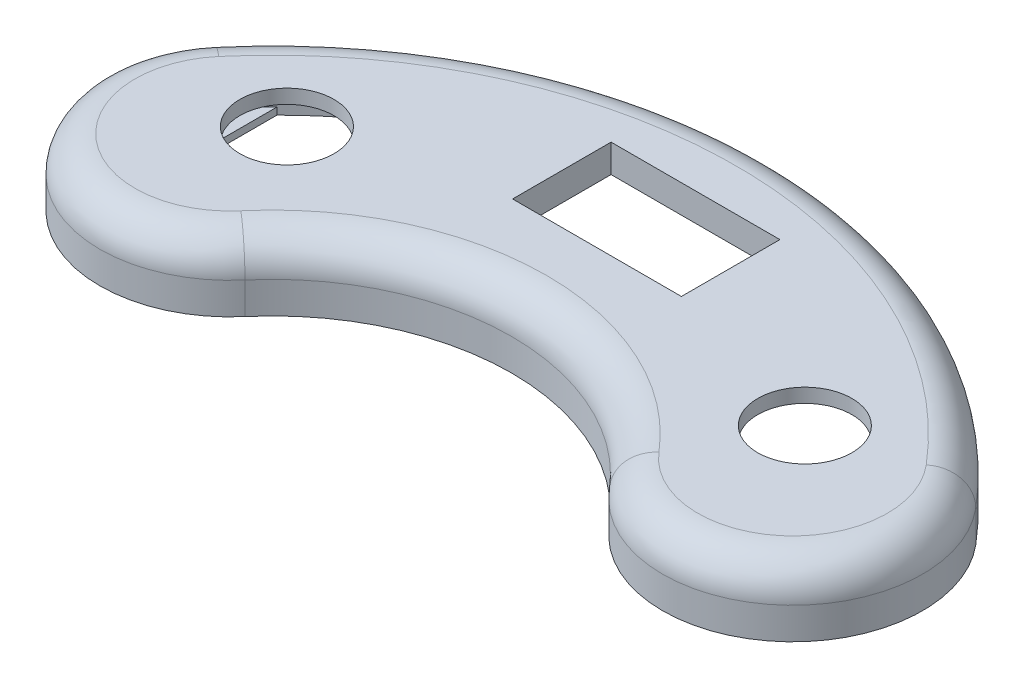
ISO-10303-21;
HEADER;
FILE_DESCRIPTION(('STEP AP214'),'2;1');
FILE_NAME('part.step','',(''),(''),'','','');
FILE_SCHEMA(('AUTOMOTIVE_DESIGN { 1 0 10303 214 1 1 1 1 }'));
ENDSEC;
DATA;
#1=APPLICATION_CONTEXT('core data for automotive mechanical design processes');
#2=APPLICATION_PROTOCOL_DEFINITION('international standard','automotive_design',2000,#1);
#3=PRODUCT_CONTEXT('',#1,'mechanical');
#4=PRODUCT('Part','Part','',(#3));
#5=PRODUCT_RELATED_PRODUCT_CATEGORY('part','',(#4));
#6=PRODUCT_DEFINITION_FORMATION('','',#4);
#7=PRODUCT_DEFINITION_CONTEXT('part definition',#1,'design');
#8=PRODUCT_DEFINITION('design','',#6,#7);
#9=PRODUCT_DEFINITION_SHAPE('','',#8);
#10=(LENGTH_UNIT() NAMED_UNIT(*) SI_UNIT(.MILLI.,.METRE.));
#11=(NAMED_UNIT(*) PLANE_ANGLE_UNIT() SI_UNIT($,.RADIAN.));
#12=(NAMED_UNIT(*) SI_UNIT($,.STERADIAN.) SOLID_ANGLE_UNIT());
#13=UNCERTAINTY_MEASURE_WITH_UNIT(LENGTH_MEASURE(1.E-05),#10,'distance_accuracy_value','');
#14=(GEOMETRIC_REPRESENTATION_CONTEXT(3) GLOBAL_UNCERTAINTY_ASSIGNED_CONTEXT((#13)) GLOBAL_UNIT_ASSIGNED_CONTEXT((#10,
#11,#12)) REPRESENTATION_CONTEXT('',''));
#15=CARTESIAN_POINT('',(0.,0.,0.));
#16=DIRECTION('',(0.,0.,1.));
#17=DIRECTION('',(1.,0.,0.));
#18=AXIS2_PLACEMENT_3D('',#15,#16,#17);
#19=CARTESIAN_POINT('',(7.10637196599272,19.05,43.0279017301496));
#20=DIRECTION('',(0.,-1.,0.));
#21=DIRECTION('',(0.,0.,-1.));
#22=AXIS2_PLACEMENT_3D('',#19,#20,#21);
#23=CYLINDRICAL_SURFACE('',#22,87.5028658682994);
#24=CARTESIAN_POINT('',(7.10637196599272,10.795,43.0279017301496));
#25=DIRECTION('',(0.,-1.,0.));
#26=DIRECTION('',(0.,0.,-1.));
#27=AXIS2_PLACEMENT_3D('',#24,#25,#26);
#28=CIRCLE('',#27,87.5028658682994);
#29=CARTESIAN_POINT('',(-56.9276674799536,10.795,-16.6076021865659));
#30=VERTEX_POINT('',#29);
#31=CARTESIAN_POINT('',(-54.3876674799536,10.795,-19.2234809676347));
#32=VERTEX_POINT('',#31);
#33=EDGE_CURVE('E458',#30,#32,#28,.T.);
#34=ORIENTED_EDGE('',*,*,#33,.T.);
#35=DIRECTION('',(0.,-1.,0.));
#36=VECTOR('',#35,1.);
#37=CARTESIAN_POINT('',(-54.3876674799537,19.05,-19.2234809676347));
#38=LINE('',#37,#36);
#39=CARTESIAN_POINT('',(-54.3876674799537,9.525,-19.2234809676347));
#40=VERTEX_POINT('',#39);
#41=EDGE_CURVE('E461',#32,#40,#38,.T.);
#42=ORIENTED_EDGE('',*,*,#41,.T.);
#43=CARTESIAN_POINT('',(7.10637196599272,9.525,43.0279017301496));
#44=DIRECTION('',(0.,1.,0.));
#45=DIRECTION('',(0.,0.,1.));
#46=AXIS2_PLACEMENT_3D('',#43,#44,#45);
#47=CIRCLE('',#46,87.5028658682994);
#48=CARTESIAN_POINT('',(68.6004114119391,9.525,-19.2234809676347));
#49=VERTEX_POINT('',#48);
#50=EDGE_CURVE('E243',#49,#40,#47,.T.);
#51=ORIENTED_EDGE('',*,*,#50,.F.);
#52=DIRECTION('',(0.,-1.,0.));
#53=VECTOR('',#52,1.);
#54=CARTESIAN_POINT('',(68.6004114119391,19.05,-19.2234809676347));
#55=LINE('',#54,#53);
#56=CARTESIAN_POINT('',(68.600411411939,10.795,-19.2234809676347));
#57=VERTEX_POINT('',#56);
#58=EDGE_CURVE('E440',#49,#57,#55,.F.);
#59=ORIENTED_EDGE('',*,*,#58,.T.);
#60=CARTESIAN_POINT('',(7.10637196599272,10.795,43.0279017301496));
#61=DIRECTION('',(0.,1.,0.));
#62=DIRECTION('',(0.,0.,1.));
#63=AXIS2_PLACEMENT_3D('',#60,#61,#62);
#64=CIRCLE('',#63,87.5028658682994);
#65=CARTESIAN_POINT('',(71.1404114119391,10.795,-16.6076021865659));
#66=VERTEX_POINT('',#65);
#67=EDGE_CURVE('E44',#66,#57,#64,.T.);
#68=ORIENTED_EDGE('',*,*,#67,.F.);
#69=DIRECTION('',(0.,-1.,0.));
#70=VECTOR('',#69,1.);
#71=CARTESIAN_POINT('',(71.1404114119391,19.05,-16.6076021865659));
#72=LINE('',#71,#70);
#73=CARTESIAN_POINT('',(71.1404114119391,9.525,-16.6076021865659));
#74=VERTEX_POINT('',#73);
#75=EDGE_CURVE('E451',#66,#74,#72,.T.);
#76=ORIENTED_EDGE('',*,*,#75,.T.);
#77=CARTESIAN_POINT('',(73.876796529036,9.525,-13.5270444623503));
#78=VERTEX_POINT('',#77);
#79=EDGE_CURVE('E245',#78,#74,#47,.T.);
#80=ORIENTED_EDGE('',*,*,#79,.F.);
#81=DIRECTION('',(0.,-1.,0.));
#82=VECTOR('',#81,1.);
#83=CARTESIAN_POINT('',(73.876796529036,19.05,-13.5270444623503));
#84=LINE('',#83,#82);
#85=CARTESIAN_POINT('',(73.876796529036,15.24,-13.5270444623503));
#86=VERTEX_POINT('',#85);
#87=EDGE_CURVE('E321',#86,#78,#84,.T.);
#88=ORIENTED_EDGE('',*,*,#87,.F.);
#89=CARTESIAN_POINT('',(7.10637196599272,15.24,43.0279017301496));
#90=DIRECTION('',(0.,1.,0.));
#91=DIRECTION('',(0.,0.,1.));
#92=AXIS2_PLACEMENT_3D('',#89,#90,#91);
#93=CIRCLE('',#92,87.5028658682994);
#94=CARTESIAN_POINT('',(-59.6640525970506,15.24,-13.5270444623502));
#95=VERTEX_POINT('',#94);
#96=EDGE_CURVE('E338',#95,#86,#93,.F.);
#97=ORIENTED_EDGE('',*,*,#96,.F.);
#98=DIRECTION('',(0.,-1.,0.));
#99=VECTOR('',#98,1.);
#100=CARTESIAN_POINT('',(-59.6640525970506,19.05,-13.5270444623502));
#101=LINE('',#100,#99);
#102=CARTESIAN_POINT('',(-59.6640525970506,9.525,-13.5270444623502));
#103=VERTEX_POINT('',#102);
#104=EDGE_CURVE('E319',#95,#103,#101,.T.);
#105=ORIENTED_EDGE('',*,*,#104,.T.);
#106=CARTESIAN_POINT('',(-56.9276674799537,9.525,-16.6076021865659));
#107=VERTEX_POINT('',#106);
#108=EDGE_CURVE('E240',#107,#103,#47,.T.);
#109=ORIENTED_EDGE('',*,*,#108,.F.);
#110=DIRECTION('',(0.,-1.,0.));
#111=VECTOR('',#110,1.);
#112=CARTESIAN_POINT('',(-56.9276674799537,19.05,-16.6076021865659));
#113=LINE('',#112,#111);
#114=EDGE_CURVE('E225',#107,#30,#113,.F.);
#115=ORIENTED_EDGE('',*,*,#114,.T.);
#116=EDGE_LOOP('',(#34,#42,#51,#59,#68,#76,#80,#88,#97,#105,#109,#115));
#117=FACE_BOUND('',#116,.T.);
#118=ADVANCED_FACE('F36',(#117),#23,.F.);
#119=CARTESIAN_POINT('',(-43.6936280340073,19.05,0.));
#120=DIRECTION('',(0.,-1.,0.));
#121=DIRECTION('',(0.,0.,-1.));
#122=AXIS2_PLACEMENT_3D('',#119,#120,#121);
#123=CYLINDRICAL_SURFACE('',#122,20.929295081542);
#124=CARTESIAN_POINT('',(-43.6936280340073,9.525,0.));
#125=DIRECTION('',(0.,1.,0.));
#126=DIRECTION('',(0.,0.,1.));
#127=AXIS2_PLACEMENT_3D('',#124,#125,#126);
#128=CIRCLE('',#127,20.929295081542);
#129=CARTESIAN_POINT('',(-54.3876674799537,9.525,17.9909119540617));
#130=VERTEX_POINT('',#129);
#131=CARTESIAN_POINT('',(-27.723203470964,9.525,13.5270444623503));
#132=VERTEX_POINT('',#131);
#133=EDGE_CURVE('E241',#130,#132,#128,.T.);
#134=ORIENTED_EDGE('',*,*,#133,.F.);
#135=DIRECTION('',(0.,-1.,0.));
#136=VECTOR('',#135,1.);
#137=CARTESIAN_POINT('',(-54.3876674799537,19.05,17.9909119540617));
#138=LINE('',#137,#136);
#139=CARTESIAN_POINT('',(-54.3876674799537,10.795,17.9909119540617));
#140=VERTEX_POINT('',#139);
#141=EDGE_CURVE('E463',#130,#140,#138,.F.);
#142=ORIENTED_EDGE('',*,*,#141,.T.);
#143=CARTESIAN_POINT('',(-43.6936280340073,10.795,0.));
#144=DIRECTION('',(0.,-1.,0.));
#145=DIRECTION('',(0.,0.,-1.));
#146=AXIS2_PLACEMENT_3D('',#143,#144,#145);
#147=CIRCLE('',#146,20.929295081542);
#148=CARTESIAN_POINT('',(-56.9276674799537,10.795,16.2140554012065));
#149=VERTEX_POINT('',#148);
#150=EDGE_CURVE('E12',#140,#149,#147,.T.);
#151=ORIENTED_EDGE('',*,*,#150,.T.);
#152=DIRECTION('',(0.,-1.,0.));
#153=VECTOR('',#152,1.);
#154=CARTESIAN_POINT('',(-56.9276674799537,19.05,16.2140554012065));
#155=LINE('',#154,#153);
#156=CARTESIAN_POINT('',(-56.9276674799537,9.525,16.2140554012065));
#157=VERTEX_POINT('',#156);
#158=EDGE_CURVE('E222',#149,#157,#155,.T.);
#159=ORIENTED_EDGE('',*,*,#158,.T.);
#160=EDGE_CURVE('E234',#103,#157,#128,.T.);
#161=ORIENTED_EDGE('',*,*,#160,.F.);
#162=ORIENTED_EDGE('',*,*,#104,.F.);
#163=CARTESIAN_POINT('',(-43.6936280340073,15.24,0.));
#164=DIRECTION('',(0.,1.,0.));
#165=DIRECTION('',(0.,0.,1.));
#166=AXIS2_PLACEMENT_3D('',#163,#164,#165);
#167=CIRCLE('',#166,20.929295081542);
#168=CARTESIAN_POINT('',(-27.723203470964,15.24,13.5270444623503));
#169=VERTEX_POINT('',#168);
#170=EDGE_CURVE('E336',#169,#95,#167,.F.);
#171=ORIENTED_EDGE('',*,*,#170,.F.);
#172=DIRECTION('',(0.,-1.,0.));
#173=VECTOR('',#172,1.);
#174=CARTESIAN_POINT('',(-27.723203470964,19.05,13.5270444623503));
#175=LINE('',#174,#173);
#176=EDGE_CURVE('E315',#169,#132,#175,.T.);
#177=ORIENTED_EDGE('',*,*,#176,.T.);
#178=EDGE_LOOP('',(#134,#142,#151,#159,#161,#162,#171,#177));
#179=FACE_BOUND('',#178,.T.);
#180=ADVANCED_FACE('F232',(#179),#123,.F.);
#181=CARTESIAN_POINT('',(57.9063719659927,19.05,0.));
#182=DIRECTION('',(0.,-1.,0.));
#183=DIRECTION('',(0.,0.,-1.));
#184=AXIS2_PLACEMENT_3D('',#181,#182,#183);
#185=CYLINDRICAL_SURFACE('',#184,20.929295081542);
#186=CARTESIAN_POINT('',(57.9063719659927,10.795,0.));
#187=DIRECTION('',(0.,1.,0.));
#188=DIRECTION('',(0.,0.,1.));
#189=AXIS2_PLACEMENT_3D('',#186,#187,#188);
#190=CIRCLE('',#189,20.929295081542);
#191=CARTESIAN_POINT('',(68.6004114119391,10.795,17.9909119540617));
#192=VERTEX_POINT('',#191);
#193=CARTESIAN_POINT('',(71.1404114119391,10.795,16.2140554012065));
#194=VERTEX_POINT('',#193);
#195=EDGE_CURVE('E246',#192,#194,#190,.T.);
#196=ORIENTED_EDGE('',*,*,#195,.F.);
#197=DIRECTION('',(0.,-1.,0.));
#198=VECTOR('',#197,1.);
#199=CARTESIAN_POINT('',(68.6004114119391,19.05,17.9909119540617));
#200=LINE('',#199,#198);
#201=CARTESIAN_POINT('',(68.6004114119391,9.525,17.9909119540617));
#202=VERTEX_POINT('',#201);
#203=EDGE_CURVE('E443',#192,#202,#200,.T.);
#204=ORIENTED_EDGE('',*,*,#203,.T.);
#205=CARTESIAN_POINT('',(57.9063719659927,9.525,0.));
#206=DIRECTION('',(0.,1.,0.));
#207=DIRECTION('',(0.,0.,1.));
#208=AXIS2_PLACEMENT_3D('',#205,#206,#207);
#209=CIRCLE('',#208,20.929295081542);
#210=CARTESIAN_POINT('',(41.9359474029494,9.525,13.5270444623503));
#211=VERTEX_POINT('',#210);
#212=EDGE_CURVE('E252',#211,#202,#209,.T.);
#213=ORIENTED_EDGE('',*,*,#212,.F.);
#214=DIRECTION('',(0.,-1.,0.));
#215=VECTOR('',#214,1.);
#216=CARTESIAN_POINT('',(41.9359474029494,19.05,13.5270444623503));
#217=LINE('',#216,#215);
#218=CARTESIAN_POINT('',(41.9359474029494,15.24,13.5270444623503));
#219=VERTEX_POINT('',#218);
#220=EDGE_CURVE('E313',#219,#211,#217,.T.);
#221=ORIENTED_EDGE('',*,*,#220,.F.);
#222=CARTESIAN_POINT('',(57.9063719659927,15.24,0.));
#223=DIRECTION('',(0.,1.,0.));
#224=DIRECTION('',(0.,0.,1.));
#225=AXIS2_PLACEMENT_3D('',#222,#223,#224);
#226=CIRCLE('',#225,20.929295081542);
#227=EDGE_CURVE('E340',#86,#219,#226,.F.);
#228=ORIENTED_EDGE('',*,*,#227,.F.);
#229=ORIENTED_EDGE('',*,*,#87,.T.);
#230=CARTESIAN_POINT('',(71.1404114119391,9.525,16.2140554012065));
#231=VERTEX_POINT('',#230);
#232=EDGE_CURVE('E251',#231,#78,#209,.T.);
#233=ORIENTED_EDGE('',*,*,#232,.F.);
#234=DIRECTION('',(0.,-1.,0.));
#235=VECTOR('',#234,1.);
#236=CARTESIAN_POINT('',(71.1404114119391,19.05,16.2140554012065));
#237=LINE('',#236,#235);
#238=EDGE_CURVE('E448',#231,#194,#237,.F.);
#239=ORIENTED_EDGE('',*,*,#238,.T.);
#240=EDGE_LOOP('',(#196,#204,#213,#221,#228,#229,#233,#239));
#241=FACE_BOUND('',#240,.T.);
#242=ADVANCED_FACE('F507',(#241),#185,.F.);
#243=CARTESIAN_POINT('',(32.5063719659927,21.59,21.5139508650748));
#244=DIRECTION('',(0.,1.,0.));
#245=DIRECTION('',(0.,0.,1.));
#246=AXIS2_PLACEMENT_3D('',#243,#244,#245);
#247=PLANE('',#246);
#248=CARTESIAN_POINT('',(53.8552329844878,21.59,-6.26058606286144));
#249=DIRECTION('',(0.,1.,0.));
#250=DIRECTION('',(0.,0.,1.));
#251=AXIS2_PLACEMENT_3D('',#248,#249,#250);
#252=CIRCLE('',#251,8.50000000000001);
#253=CARTESIAN_POINT('',(53.8552329844878,21.59,2.23941393713857));
#254=VERTEX_POINT('',#253);
#255=EDGE_CURVE('E267',#254,#254,#252,.T.);
#256=ORIENTED_EDGE('',*,*,#255,.F.);
#257=EDGE_LOOP('',(#256));
#258=FACE_BOUND('',#257,.T.);
#259=CARTESIAN_POINT('',(-39.6424890525023,21.59,-6.26058606286144));
#260=DIRECTION('',(0.,1.,0.));
#261=DIRECTION('',(0.,0.,1.));
#262=AXIS2_PLACEMENT_3D('',#259,#260,#261);
#263=CIRCLE('',#262,8.5);
#264=CARTESIAN_POINT('',(-39.6424890525023,21.59,2.23941393713856));
#265=VERTEX_POINT('',#264);
#266=EDGE_CURVE('E271',#265,#265,#263,.T.);
#267=ORIENTED_EDGE('',*,*,#266,.F.);
#268=EDGE_LOOP('',(#267));
#269=FACE_BOUND('',#268,.T.);
#270=CARTESIAN_POINT('',(-43.6936280340073,21.59,0.));
#271=DIRECTION('',(0.,1.,0.));
#272=DIRECTION('',(0.,0.,1.));
#273=AXIS2_PLACEMENT_3D('',#270,#271,#272);
#274=CIRCLE('',#273,17.119295081542);
#275=CARTESIAN_POINT('',(-56.7567727604326,21.59,-11.0645611727431));
#276=VERTEX_POINT('',#275);
#277=CARTESIAN_POINT('',(-30.630483307582,21.59,11.0645611727431));
#278=VERTEX_POINT('',#277);
#279=EDGE_CURVE('E351',#276,#278,#274,.T.);
#280=ORIENTED_EDGE('',*,*,#279,.T.);
#281=CARTESIAN_POINT('',(7.10637196599272,21.59,43.0279017301496));
#282=DIRECTION('',(0.,1.,0.));
#283=DIRECTION('',(0.,0.,1.));
#284=AXIS2_PLACEMENT_3D('',#281,#282,#283);
#285=CIRCLE('',#284,49.4542757052155);
#286=CARTESIAN_POINT('',(44.8432272395674,21.59,11.0645611727431));
#287=VERTEX_POINT('',#286);
#288=EDGE_CURVE('E353',#278,#287,#285,.F.);
#289=ORIENTED_EDGE('',*,*,#288,.T.);
#290=CARTESIAN_POINT('',(57.9063719659927,21.59,0.));
#291=DIRECTION('',(0.,1.,0.));
#292=DIRECTION('',(0.,0.,1.));
#293=AXIS2_PLACEMENT_3D('',#290,#291,#292);
#294=CIRCLE('',#293,17.119295081542);
#295=CARTESIAN_POINT('',(70.969516692418,21.59,-11.0645611727431));
#296=VERTEX_POINT('',#295);
#297=EDGE_CURVE('E358',#287,#296,#294,.T.);
#298=ORIENTED_EDGE('',*,*,#297,.T.);
#299=CARTESIAN_POINT('',(7.10637196599272,21.59,43.0279017301496));
#300=DIRECTION('',(0.,1.,0.));
#301=DIRECTION('',(0.,0.,1.));
#302=AXIS2_PLACEMENT_3D('',#299,#300,#301);
#303=CIRCLE('',#302,83.6928658682994);
#304=EDGE_CURVE('E354',#296,#276,#303,.T.);
#305=ORIENTED_EDGE('',*,*,#304,.T.);
#306=EDGE_LOOP('',(#280,#289,#298,#305));
#307=FACE_BOUND('',#306,.T.);
#308=DIRECTION('',(0.,0.,1.));
#309=VECTOR('',#308,1.);
#310=CARTESIAN_POINT('',(-7.95035958705516,21.59,21.5139508650748));
#311=LINE('',#310,#309);
#312=CARTESIAN_POINT('',(-7.95035958705517,21.59,-33.0865472509014));
#313=VERTEX_POINT('',#312);
#314=CARTESIAN_POINT('',(-7.95035958705517,21.59,-15.3065472509014));
#315=VERTEX_POINT('',#314);
#316=EDGE_CURVE('E362',#313,#315,#311,.T.);
#317=ORIENTED_EDGE('',*,*,#316,.F.);
#318=DIRECTION('',(1.,0.,0.));
#319=VECTOR('',#318,1.);
#320=CARTESIAN_POINT('',(32.5063719659927,21.59,-33.0865472509014));
#321=LINE('',#320,#319);
#322=CARTESIAN_POINT('',(22.5296404129448,21.59,-33.0865472509014));
#323=VERTEX_POINT('',#322);
#324=EDGE_CURVE('E342',#313,#323,#321,.T.);
#325=ORIENTED_EDGE('',*,*,#324,.T.);
#326=DIRECTION('',(0.,0.,1.));
#327=VECTOR('',#326,1.);
#328=CARTESIAN_POINT('',(22.5296404129448,21.59,21.5139508650748));
#329=LINE('',#328,#327);
#330=CARTESIAN_POINT('',(22.5296404129448,21.59,-15.3065472509014));
#331=VERTEX_POINT('',#330);
#332=EDGE_CURVE('E369',#323,#331,#329,.T.);
#333=ORIENTED_EDGE('',*,*,#332,.T.);
#334=DIRECTION('',(1.,0.,0.));
#335=VECTOR('',#334,1.);
#336=CARTESIAN_POINT('',(32.5063719659927,21.59,-15.3065472509014));
#337=LINE('',#336,#335);
#338=EDGE_CURVE('E366',#315,#331,#337,.T.);
#339=ORIENTED_EDGE('',*,*,#338,.F.);
#340=EDGE_LOOP('',(#317,#325,#333,#339));
#341=FACE_BOUND('',#340,.T.);
#342=ADVANCED_FACE('F513',(#258,#269,#307,#341),#247,.T.);
#343=CARTESIAN_POINT('',(57.9063719659927,19.05,0.));
#344=DIRECTION('',(0.,-1.,0.));
#345=DIRECTION('',(0.,0.,-1.));
#346=AXIS2_PLACEMENT_3D('',#343,#344,#345);
#347=CYLINDRICAL_SURFACE('',#346,23.469295081542);
#348=DIRECTION('',(0.,-1.,0.));
#349=VECTOR('',#348,1.);
#350=CARTESIAN_POINT('',(39.9977608452041,19.05,15.168699988755));
#351=LINE('',#350,#349);
#352=CARTESIAN_POINT('',(39.9977608452041,15.24,15.168699988755));
#353=VERTEX_POINT('',#352);
#354=CARTESIAN_POINT('',(39.9977608452041,9.525,15.168699988755));
#355=VERTEX_POINT('',#354);
#356=EDGE_CURVE('E385',#353,#355,#351,.T.);
#357=ORIENTED_EDGE('',*,*,#356,.T.);
#358=CARTESIAN_POINT('',(57.9063719659927,9.525,0.));
#359=DIRECTION('',(0.,1.,0.));
#360=DIRECTION('',(0.,0.,1.));
#361=AXIS2_PLACEMENT_3D('',#358,#359,#360);
#362=CIRCLE('',#361,23.469295081542);
#363=CARTESIAN_POINT('',(75.8149830867813,9.525,-15.168699988755));
#364=VERTEX_POINT('',#363);
#365=EDGE_CURVE('E264',#355,#364,#362,.T.);
#366=ORIENTED_EDGE('',*,*,#365,.T.);
#367=DIRECTION('',(0.,-1.,0.));
#368=VECTOR('',#367,1.);
#369=CARTESIAN_POINT('',(75.8149830867813,19.05,-15.168699988755));
#370=LINE('',#369,#368);
#371=CARTESIAN_POINT('',(75.8149830867813,15.24,-15.168699988755));
#372=VERTEX_POINT('',#371);
#373=EDGE_CURVE('E360',#372,#364,#370,.T.);
#374=ORIENTED_EDGE('',*,*,#373,.F.);
#375=CARTESIAN_POINT('',(57.9063719659927,15.24,0.));
#376=DIRECTION('',(0.,-1.,0.));
#377=DIRECTION('',(0.,0.,-1.));
#378=AXIS2_PLACEMENT_3D('',#375,#376,#377);
#379=CIRCLE('',#378,23.469295081542);
#380=EDGE_CURVE('E381',#372,#353,#379,.T.);
#381=ORIENTED_EDGE('',*,*,#380,.T.);
#382=EDGE_LOOP('',(#357,#366,#374,#381));
#383=FACE_BOUND('',#382,.T.);
#384=ADVANCED_FACE('F531',(#383),#347,.T.);
#385=CARTESIAN_POINT('',(7.10637196599272,19.05,43.0279017301496));
#386=DIRECTION('',(0.,-1.,0.));
#387=DIRECTION('',(0.,0.,-1.));
#388=AXIS2_PLACEMENT_3D('',#385,#386,#387);
#389=CYLINDRICAL_SURFACE('',#388,90.0428658682994);
#390=ORIENTED_EDGE('',*,*,#373,.T.);
#391=CARTESIAN_POINT('',(7.10637196599272,9.525,43.0279017301496));
#392=DIRECTION('',(0.,1.,0.));
#393=DIRECTION('',(0.,0.,1.));
#394=AXIS2_PLACEMENT_3D('',#391,#392,#393);
#395=CIRCLE('',#394,90.0428658682994);
#396=CARTESIAN_POINT('',(-61.6022391547959,9.525,-15.168699988755));
#397=VERTEX_POINT('',#396);
#398=EDGE_CURVE('E261',#364,#397,#395,.T.);
#399=ORIENTED_EDGE('',*,*,#398,.T.);
#400=DIRECTION('',(0.,-1.,0.));
#401=VECTOR('',#400,1.);
#402=CARTESIAN_POINT('',(-61.6022391547959,19.05,-15.168699988755));
#403=LINE('',#402,#401);
#404=CARTESIAN_POINT('',(-61.6022391547959,15.24,-15.168699988755));
#405=VERTEX_POINT('',#404);
#406=EDGE_CURVE('E391',#405,#397,#403,.T.);
#407=ORIENTED_EDGE('',*,*,#406,.F.);
#408=CARTESIAN_POINT('',(7.10637196599272,15.24,43.0279017301496));
#409=DIRECTION('',(0.,-1.,0.));
#410=DIRECTION('',(0.,0.,-1.));
#411=AXIS2_PLACEMENT_3D('',#408,#409,#410);
#412=CIRCLE('',#411,90.0428658682994);
#413=EDGE_CURVE('E379',#405,#372,#412,.T.);
#414=ORIENTED_EDGE('',*,*,#413,.T.);
#415=EDGE_LOOP('',(#390,#399,#407,#414));
#416=FACE_BOUND('',#415,.T.);
#417=ADVANCED_FACE('F535',(#416),#389,.T.);
#418=CARTESIAN_POINT('',(-43.6936280340073,19.05,0.));
#419=DIRECTION('',(0.,-1.,0.));
#420=DIRECTION('',(0.,0.,-1.));
#421=AXIS2_PLACEMENT_3D('',#418,#419,#420);
#422=CYLINDRICAL_SURFACE('',#421,23.469295081542);
#423=ORIENTED_EDGE('',*,*,#406,.T.);
#424=CARTESIAN_POINT('',(-43.6936280340073,9.525,0.));
#425=DIRECTION('',(0.,1.,0.));
#426=DIRECTION('',(0.,0.,1.));
#427=AXIS2_PLACEMENT_3D('',#424,#425,#426);
#428=CIRCLE('',#427,23.469295081542);
#429=CARTESIAN_POINT('',(-25.7850169132187,9.525,15.168699988755));
#430=VERTEX_POINT('',#429);
#431=EDGE_CURVE('E258',#397,#430,#428,.T.);
#432=ORIENTED_EDGE('',*,*,#431,.T.);
#433=DIRECTION('',(0.,-1.,0.));
#434=VECTOR('',#433,1.);
#435=CARTESIAN_POINT('',(-25.7850169132187,19.05,15.168699988755));
#436=LINE('',#435,#434);
#437=CARTESIAN_POINT('',(-25.7850169132187,15.24,15.168699988755));
#438=VERTEX_POINT('',#437);
#439=EDGE_CURVE('E388',#438,#430,#436,.T.);
#440=ORIENTED_EDGE('',*,*,#439,.F.);
#441=CARTESIAN_POINT('',(-43.6936280340073,15.24,0.));
#442=DIRECTION('',(0.,-1.,0.));
#443=DIRECTION('',(0.,0.,-1.));
#444=AXIS2_PLACEMENT_3D('',#441,#442,#443);
#445=CIRCLE('',#444,23.469295081542);
#446=EDGE_CURVE('E382',#438,#405,#445,.T.);
#447=ORIENTED_EDGE('',*,*,#446,.T.);
#448=EDGE_LOOP('',(#423,#432,#440,#447));
#449=FACE_BOUND('',#448,.T.);
#450=ADVANCED_FACE('F539',(#449),#422,.T.);
#451=CARTESIAN_POINT('',(7.10637196599272,19.05,43.0279017301496));
#452=DIRECTION('',(0.,-1.,0.));
#453=DIRECTION('',(0.,0.,-1.));
#454=AXIS2_PLACEMENT_3D('',#451,#452,#453);
#455=CYLINDRICAL_SURFACE('',#454,43.1042757052155);
#456=ORIENTED_EDGE('',*,*,#439,.T.);
#457=CARTESIAN_POINT('',(7.10637196599272,9.525,43.0279017301496));
#458=DIRECTION('',(0.,1.,0.));
#459=DIRECTION('',(0.,0.,1.));
#460=AXIS2_PLACEMENT_3D('',#457,#458,#459);
#461=CIRCLE('',#460,43.1042757052155);
#462=EDGE_CURVE('E255',#430,#355,#461,.F.);
#463=ORIENTED_EDGE('',*,*,#462,.T.);
#464=ORIENTED_EDGE('',*,*,#356,.F.);
#465=CARTESIAN_POINT('',(7.10637196599272,15.24,43.0279017301496));
#466=DIRECTION('',(0.,-1.,0.));
#467=DIRECTION('',(0.,0.,-1.));
#468=AXIS2_PLACEMENT_3D('',#465,#466,#467);
#469=CIRCLE('',#468,43.1042757052155);
#470=EDGE_CURVE('E357',#353,#438,#469,.F.);
#471=ORIENTED_EDGE('',*,*,#470,.T.);
#472=EDGE_LOOP('',(#456,#463,#464,#471));
#473=FACE_BOUND('',#472,.T.);
#474=ADVANCED_FACE('F543',(#473),#455,.F.);
#475=CARTESIAN_POINT('',(7.10637196599272,15.24,43.0279017301496));
#476=DIRECTION('',(0.,1.,0.));
#477=DIRECTION('',(0.,0.,1.));
#478=AXIS2_PLACEMENT_3D('',#475,#476,#477);
#479=TOROIDAL_SURFACE('',#478,83.6928658682994,6.35);
#480=CARTESIAN_POINT('',(70.969516692418,15.24,-11.0645611727431));
#481=DIRECTION('',(0.646321073387707,0.,0.763065573915481));
#482=DIRECTION('',(0.763065573915481,0.,-0.646321073387707));
#483=AXIS2_PLACEMENT_3D('',#480,#481,#482);
#484=CIRCLE('',#483,6.35);
#485=EDGE_CURVE('E374',#372,#296,#484,.T.);
#486=ORIENTED_EDGE('',*,*,#485,.F.);
#487=ORIENTED_EDGE('',*,*,#413,.F.);
#488=CARTESIAN_POINT('',(-56.7567727604326,15.24,-11.0645611727431));
#489=DIRECTION('',(0.646321073387707,0.,-0.763065573915481));
#490=DIRECTION('',(-0.763065573915481,0.,-0.646321073387707));
#491=AXIS2_PLACEMENT_3D('',#488,#489,#490);
#492=CIRCLE('',#491,6.35);
#493=EDGE_CURVE('E377',#276,#405,#492,.F.);
#494=ORIENTED_EDGE('',*,*,#493,.F.);
#495=ORIENTED_EDGE('',*,*,#304,.F.);
#496=EDGE_LOOP('',(#486,#487,#494,#495));
#497=FACE_BOUND('',#496,.T.);
#498=ADVANCED_FACE('F547',(#497),#479,.T.);
#499=CARTESIAN_POINT('',(-43.6936280340073,15.24,0.));
#500=DIRECTION('',(0.,1.,0.));
#501=DIRECTION('',(0.,0.,1.));
#502=AXIS2_PLACEMENT_3D('',#499,#500,#501);
#503=TOROIDAL_SURFACE('',#502,17.119295081542,6.35);
#504=ORIENTED_EDGE('',*,*,#493,.T.);
#505=ORIENTED_EDGE('',*,*,#446,.F.);
#506=CARTESIAN_POINT('',(-30.630483307582,15.24,11.0645611727431));
#507=DIRECTION('',(0.646321073387707,0.,-0.763065573915481));
#508=DIRECTION('',(-0.763065573915481,0.,-0.646321073387707));
#509=AXIS2_PLACEMENT_3D('',#506,#507,#508);
#510=CIRCLE('',#509,6.35);
#511=EDGE_CURVE('E378',#278,#438,#510,.T.);
#512=ORIENTED_EDGE('',*,*,#511,.F.);
#513=ORIENTED_EDGE('',*,*,#279,.F.);
#514=EDGE_LOOP('',(#504,#505,#512,#513));
#515=FACE_BOUND('',#514,.T.);
#516=ADVANCED_FACE('F551',(#515),#503,.T.);
#517=CARTESIAN_POINT('',(57.9063719659927,15.24,0.));
#518=DIRECTION('',(0.,1.,0.));
#519=DIRECTION('',(0.,0.,1.));
#520=AXIS2_PLACEMENT_3D('',#517,#518,#519);
#521=TOROIDAL_SURFACE('',#520,17.119295081542,6.35);
#522=ORIENTED_EDGE('',*,*,#485,.T.);
#523=ORIENTED_EDGE('',*,*,#297,.F.);
#524=CARTESIAN_POINT('',(44.8432272395674,15.24,11.0645611727431));
#525=DIRECTION('',(0.646321073387707,0.,0.763065573915481));
#526=DIRECTION('',(0.763065573915481,0.,-0.646321073387707));
#527=AXIS2_PLACEMENT_3D('',#524,#525,#526);
#528=CIRCLE('',#527,6.35);
#529=EDGE_CURVE('E402',#353,#287,#528,.F.);
#530=ORIENTED_EDGE('',*,*,#529,.F.);
#531=ORIENTED_EDGE('',*,*,#380,.F.);
#532=EDGE_LOOP('',(#522,#523,#530,#531));
#533=FACE_BOUND('',#532,.T.);
#534=ADVANCED_FACE('F555',(#533),#521,.T.);
#535=CARTESIAN_POINT('',(7.10637196599272,15.24,43.0279017301496));
#536=DIRECTION('',(0.,1.,0.));
#537=DIRECTION('',(0.,0.,1.));
#538=AXIS2_PLACEMENT_3D('',#535,#536,#537);
#539=TOROIDAL_SURFACE('',#538,49.4542757052155,6.35);
#540=ORIENTED_EDGE('',*,*,#511,.T.);
#541=ORIENTED_EDGE('',*,*,#470,.F.);
#542=ORIENTED_EDGE('',*,*,#529,.T.);
#543=ORIENTED_EDGE('',*,*,#288,.F.);
#544=EDGE_LOOP('',(#540,#541,#542,#543));
#545=FACE_BOUND('',#544,.T.);
#546=ADVANCED_FACE('F559',(#545),#539,.T.);
#547=CARTESIAN_POINT('',(-10.4903595870552,16.51,-33.0865472509014));
#548=DIRECTION('',(0.,0.,1.));
#549=DIRECTION('',(1.,0.,0.));
#550=AXIS2_PLACEMENT_3D('',#547,#548,#549);
#551=PLANE('',#550);
#552=ORIENTED_EDGE('',*,*,#324,.F.);
#553=DIRECTION('',(0.,1.,0.));
#554=VECTOR('',#553,1.);
#555=CARTESIAN_POINT('',(-7.95035958705517,16.51,-33.0865472509014));
#556=LINE('',#555,#554);
#557=CARTESIAN_POINT('',(-7.95035958705517,16.51,-33.0865472509014));
#558=VERTEX_POINT('',#557);
#559=EDGE_CURVE('E405',#558,#313,#556,.T.);
#560=ORIENTED_EDGE('',*,*,#559,.F.);
#561=DIRECTION('',(1.,0.,0.));
#562=VECTOR('',#561,1.);
#563=CARTESIAN_POINT('',(-10.4903595870552,16.51,-33.0865472509014));
#564=LINE('',#563,#562);
#565=CARTESIAN_POINT('',(22.5296404129448,16.51,-33.0865472509014));
#566=VERTEX_POINT('',#565);
#567=EDGE_CURVE('E365',#558,#566,#564,.T.);
#568=ORIENTED_EDGE('',*,*,#567,.T.);
#569=DIRECTION('',(0.,1.,0.));
#570=VECTOR('',#569,1.);
#571=CARTESIAN_POINT('',(22.5296404129448,16.51,-33.0865472509014));
#572=LINE('',#571,#570);
#573=EDGE_CURVE('E404',#566,#323,#572,.T.);
#574=ORIENTED_EDGE('',*,*,#573,.T.);
#575=EDGE_LOOP('',(#552,#560,#568,#574));
#576=FACE_BOUND('',#575,.T.);
#577=ADVANCED_FACE('F563',(#576),#551,.T.);
#578=CARTESIAN_POINT('',(22.5296404129448,16.51,-35.6265472509014));
#579=DIRECTION('',(-1.,0.,0.));
#580=DIRECTION('',(0.,0.,1.));
#581=AXIS2_PLACEMENT_3D('',#578,#579,#580);
#582=PLANE('',#581);
#583=ORIENTED_EDGE('',*,*,#332,.F.);
#584=ORIENTED_EDGE('',*,*,#573,.F.);
#585=DIRECTION('',(0.,0.,1.));
#586=VECTOR('',#585,1.);
#587=CARTESIAN_POINT('',(22.5296404129448,16.51,-35.6265472509014));
#588=LINE('',#587,#586);
#589=CARTESIAN_POINT('',(22.5296404129448,16.51,-15.3065472509014));
#590=VERTEX_POINT('',#589);
#591=EDGE_CURVE('E417',#566,#590,#588,.T.);
#592=ORIENTED_EDGE('',*,*,#591,.T.);
#593=DIRECTION('',(0.,1.,0.));
#594=VECTOR('',#593,1.);
#595=CARTESIAN_POINT('',(22.5296404129448,16.51,-15.3065472509014));
#596=LINE('',#595,#594);
#597=EDGE_CURVE('E412',#590,#331,#596,.T.);
#598=ORIENTED_EDGE('',*,*,#597,.T.);
#599=EDGE_LOOP('',(#583,#584,#592,#598));
#600=FACE_BOUND('',#599,.T.);
#601=ADVANCED_FACE('F567',(#600),#582,.T.);
#602=CARTESIAN_POINT('',(-10.4903595870552,16.51,-15.3065472509014));
#603=DIRECTION('',(0.,0.,1.));
#604=DIRECTION('',(1.,0.,0.));
#605=AXIS2_PLACEMENT_3D('',#602,#603,#604);
#606=PLANE('',#605);
#607=ORIENTED_EDGE('',*,*,#338,.T.);
#608=ORIENTED_EDGE('',*,*,#597,.F.);
#609=DIRECTION('',(1.,0.,0.));
#610=VECTOR('',#609,1.);
#611=CARTESIAN_POINT('',(-10.4903595870552,16.51,-15.3065472509014));
#612=LINE('',#611,#610);
#613=CARTESIAN_POINT('',(-7.95035958705517,16.51,-15.3065472509014));
#614=VERTEX_POINT('',#613);
#615=EDGE_CURVE('E419',#614,#590,#612,.T.);
#616=ORIENTED_EDGE('',*,*,#615,.F.);
#617=DIRECTION('',(0.,1.,0.));
#618=VECTOR('',#617,1.);
#619=CARTESIAN_POINT('',(-7.95035958705517,16.51,-15.3065472509014));
#620=LINE('',#619,#618);
#621=EDGE_CURVE('E408',#614,#315,#620,.T.);
#622=ORIENTED_EDGE('',*,*,#621,.T.);
#623=EDGE_LOOP('',(#607,#608,#616,#622));
#624=FACE_BOUND('',#623,.T.);
#625=ADVANCED_FACE('F570',(#624),#606,.F.);
#626=CARTESIAN_POINT('',(-7.95035958705517,16.51,-35.6265472509014));
#627=DIRECTION('',(-1.,0.,0.));
#628=DIRECTION('',(0.,0.,1.));
#629=AXIS2_PLACEMENT_3D('',#626,#627,#628);
#630=PLANE('',#629);
#631=ORIENTED_EDGE('',*,*,#316,.T.);
#632=ORIENTED_EDGE('',*,*,#621,.F.);
#633=DIRECTION('',(0.,0.,1.));
#634=VECTOR('',#633,1.);
#635=CARTESIAN_POINT('',(-7.95035958705517,16.51,-35.6265472509014));
#636=LINE('',#635,#634);
#637=EDGE_CURVE('E409',#558,#614,#636,.T.);
#638=ORIENTED_EDGE('',*,*,#637,.F.);
#639=ORIENTED_EDGE('',*,*,#559,.T.);
#640=EDGE_LOOP('',(#631,#632,#638,#639));
#641=FACE_BOUND('',#640,.T.);
#642=ADVANCED_FACE('F38',(#641),#630,.F.);
#643=CARTESIAN_POINT('',(32.5063719659927,19.05,21.5139508650748));
#644=DIRECTION('',(0.,1.,0.));
#645=DIRECTION('',(0.,0.,1.));
#646=AXIS2_PLACEMENT_3D('',#643,#644,#645);
#647=PLANE('',#646);
#648=CARTESIAN_POINT('',(53.8552329844878,19.05,-6.26058606286144));
#649=DIRECTION('',(0.,1.,0.));
#650=DIRECTION('',(0.,0.,1.));
#651=AXIS2_PLACEMENT_3D('',#648,#649,#650);
#652=CIRCLE('',#651,8.50000000000001);
#653=CARTESIAN_POINT('',(53.8552329844878,19.05,2.23941393713857));
#654=VERTEX_POINT('',#653);
#655=EDGE_CURVE('E268',#654,#654,#652,.T.);
#656=ORIENTED_EDGE('',*,*,#655,.T.);
#657=EDGE_LOOP('',(#656));
#658=FACE_BOUND('',#657,.T.);
#659=CARTESIAN_POINT('',(-39.6424890525023,19.05,-6.26058606286144));
#660=DIRECTION('',(0.,1.,0.));
#661=DIRECTION('',(0.,0.,1.));
#662=AXIS2_PLACEMENT_3D('',#659,#660,#661);
#663=CIRCLE('',#662,8.5);
#664=CARTESIAN_POINT('',(-39.6424890525023,19.05,2.23941393713856));
#665=VERTEX_POINT('',#664);
#666=EDGE_CURVE('E274',#665,#665,#663,.T.);
#667=ORIENTED_EDGE('',*,*,#666,.T.);
#668=EDGE_LOOP('',(#667));
#669=FACE_BOUND('',#668,.T.);
#670=CARTESIAN_POINT('',(-43.6936280340073,19.05,0.));
#671=DIRECTION('',(0.,1.,0.));
#672=DIRECTION('',(0.,0.,1.));
#673=AXIS2_PLACEMENT_3D('',#670,#671,#672);
#674=CIRCLE('',#673,17.119295081542);
#675=CARTESIAN_POINT('',(-56.7567727604326,19.05,-11.0645611727431));
#676=VERTEX_POINT('',#675);
#677=CARTESIAN_POINT('',(-30.630483307582,19.05,11.0645611727431));
#678=VERTEX_POINT('',#677);
#679=EDGE_CURVE('E328',#676,#678,#674,.T.);
#680=ORIENTED_EDGE('',*,*,#679,.F.);
#681=CARTESIAN_POINT('',(7.10637196599272,19.05,43.0279017301496));
#682=DIRECTION('',(0.,1.,0.));
#683=DIRECTION('',(0.,0.,1.));
#684=AXIS2_PLACEMENT_3D('',#681,#682,#683);
#685=CIRCLE('',#684,83.6928658682994);
#686=CARTESIAN_POINT('',(70.969516692418,19.05,-11.0645611727431));
#687=VERTEX_POINT('',#686);
#688=EDGE_CURVE('E326',#687,#676,#685,.T.);
#689=ORIENTED_EDGE('',*,*,#688,.F.);
#690=CARTESIAN_POINT('',(57.9063719659927,19.05,0.));
#691=DIRECTION('',(0.,1.,0.));
#692=DIRECTION('',(0.,0.,1.));
#693=AXIS2_PLACEMENT_3D('',#690,#691,#692);
#694=CIRCLE('',#693,17.119295081542);
#695=CARTESIAN_POINT('',(44.8432272395674,19.05,11.0645611727431));
#696=VERTEX_POINT('',#695);
#697=EDGE_CURVE('E324',#696,#687,#694,.T.);
#698=ORIENTED_EDGE('',*,*,#697,.F.);
#699=CARTESIAN_POINT('',(7.10637196599272,19.05,43.0279017301496));
#700=DIRECTION('',(0.,1.,0.));
#701=DIRECTION('',(0.,0.,1.));
#702=AXIS2_PLACEMENT_3D('',#699,#700,#701);
#703=CIRCLE('',#702,49.4542757052155);
#704=EDGE_CURVE('E330',#678,#696,#703,.F.);
#705=ORIENTED_EDGE('',*,*,#704,.F.);
#706=EDGE_LOOP('',(#680,#689,#698,#705));
#707=FACE_BOUND('',#706,.T.);
#708=DIRECTION('',(0.,0.,1.));
#709=VECTOR('',#708,1.);
#710=CARTESIAN_POINT('',(-10.4903595870552,19.05,-35.6265472509014));
#711=LINE('',#710,#709);
#712=CARTESIAN_POINT('',(-10.4903595870552,19.05,-35.6265472509014));
#713=VERTEX_POINT('',#712);
#714=CARTESIAN_POINT('',(-10.4903595870552,19.05,-12.7665472509014));
#715=VERTEX_POINT('',#714);
#716=EDGE_CURVE('E284',#713,#715,#711,.T.);
#717=ORIENTED_EDGE('',*,*,#716,.T.);
#718=DIRECTION('',(1.,0.,0.));
#719=VECTOR('',#718,1.);
#720=CARTESIAN_POINT('',(-10.4903595870552,19.05,-12.7665472509014));
#721=LINE('',#720,#719);
#722=CARTESIAN_POINT('',(25.0696404129448,19.05,-12.7665472509014));
#723=VERTEX_POINT('',#722);
#724=EDGE_CURVE('E298',#715,#723,#721,.T.);
#725=ORIENTED_EDGE('',*,*,#724,.T.);
#726=DIRECTION('',(0.,0.,1.));
#727=VECTOR('',#726,1.);
#728=CARTESIAN_POINT('',(25.0696404129448,19.05,-35.6265472509014));
#729=LINE('',#728,#727);
#730=CARTESIAN_POINT('',(25.0696404129448,19.05,-35.6265472509014));
#731=VERTEX_POINT('',#730);
#732=EDGE_CURVE('E295',#731,#723,#729,.T.);
#733=ORIENTED_EDGE('',*,*,#732,.F.);
#734=DIRECTION('',(1.,0.,0.));
#735=VECTOR('',#734,1.);
#736=CARTESIAN_POINT('',(-10.4903595870552,19.05,-35.6265472509014));
#737=LINE('',#736,#735);
#738=EDGE_CURVE('E277',#713,#731,#737,.T.);
#739=ORIENTED_EDGE('',*,*,#738,.F.);
#740=EDGE_LOOP('',(#717,#725,#733,#739));
#741=FACE_BOUND('',#740,.T.);
#742=ADVANCED_FACE('F577',(#658,#669,#707,#741),#647,.F.);
#743=CARTESIAN_POINT('',(7.10637196599272,19.05,43.0279017301496));
#744=DIRECTION('',(0.,-1.,0.));
#745=DIRECTION('',(0.,0.,-1.));
#746=AXIS2_PLACEMENT_3D('',#743,#744,#745);
#747=CYLINDRICAL_SURFACE('',#746,45.6442757052155);
#748=CARTESIAN_POINT('',(7.10637196599272,9.525,43.0279017301496));
#749=DIRECTION('',(0.,1.,0.));
#750=DIRECTION('',(0.,0.,1.));
#751=AXIS2_PLACEMENT_3D('',#748,#749,#750);
#752=CIRCLE('',#751,45.6442757052155);
#753=EDGE_CURVE('E393',#132,#211,#752,.F.);
#754=ORIENTED_EDGE('',*,*,#753,.F.);
#755=ORIENTED_EDGE('',*,*,#176,.F.);
#756=CARTESIAN_POINT('',(7.10637196599272,15.24,43.0279017301496));
#757=DIRECTION('',(0.,1.,0.));
#758=DIRECTION('',(0.,0.,1.));
#759=AXIS2_PLACEMENT_3D('',#756,#757,#758);
#760=CIRCLE('',#759,45.6442757052155);
#761=EDGE_CURVE('E333',#219,#169,#760,.T.);
#762=ORIENTED_EDGE('',*,*,#761,.F.);
#763=ORIENTED_EDGE('',*,*,#220,.T.);
#764=EDGE_LOOP('',(#754,#755,#762,#763));
#765=FACE_BOUND('',#764,.T.);
#766=ADVANCED_FACE('F487',(#765),#747,.T.);
#767=CARTESIAN_POINT('',(7.10637196599272,15.24,43.0279017301496));
#768=DIRECTION('',(0.,1.,0.));
#769=DIRECTION('',(0.,0.,1.));
#770=AXIS2_PLACEMENT_3D('',#767,#768,#769);
#771=TOROIDAL_SURFACE('',#770,83.6928658682994,3.81);
#772=CARTESIAN_POINT('',(70.969516692418,15.24,-11.0645611727431));
#773=DIRECTION('',(0.646321073387707,0.,0.763065573915481));
#774=DIRECTION('',(0.763065573915481,0.,-0.646321073387707));
#775=AXIS2_PLACEMENT_3D('',#772,#773,#774);
#776=CIRCLE('',#775,3.81);
#777=EDGE_CURVE('E346',#86,#687,#776,.T.);
#778=ORIENTED_EDGE('',*,*,#777,.T.);
#779=ORIENTED_EDGE('',*,*,#688,.T.);
#780=CARTESIAN_POINT('',(-56.7567727604326,15.24,-11.0645611727431));
#781=DIRECTION('',(-0.646321073387707,0.,0.763065573915481));
#782=DIRECTION('',(0.763065573915481,0.,0.646321073387707));
#783=AXIS2_PLACEMENT_3D('',#780,#781,#782);
#784=CIRCLE('',#783,3.81);
#785=EDGE_CURVE('E316',#676,#95,#784,.T.);
#786=ORIENTED_EDGE('',*,*,#785,.T.);
#787=ORIENTED_EDGE('',*,*,#96,.T.);
#788=EDGE_LOOP('',(#778,#779,#786,#787));
#789=FACE_BOUND('',#788,.T.);
#790=ADVANCED_FACE('F525',(#789),#771,.F.);
#791=CARTESIAN_POINT('',(-43.6936280340073,15.24,0.));
#792=DIRECTION('',(0.,1.,0.));
#793=DIRECTION('',(0.,0.,1.));
#794=AXIS2_PLACEMENT_3D('',#791,#792,#793);
#795=TOROIDAL_SURFACE('',#794,17.119295081542,3.81);
#796=ORIENTED_EDGE('',*,*,#785,.F.);
#797=ORIENTED_EDGE('',*,*,#679,.T.);
#798=CARTESIAN_POINT('',(-30.630483307582,15.24,11.0645611727431));
#799=DIRECTION('',(0.646321073387707,0.,-0.763065573915481));
#800=DIRECTION('',(-0.763065573915481,0.,-0.646321073387707));
#801=AXIS2_PLACEMENT_3D('',#798,#799,#800);
#802=CIRCLE('',#801,3.81);
#803=EDGE_CURVE('E344',#678,#169,#802,.T.);
#804=ORIENTED_EDGE('',*,*,#803,.T.);
#805=ORIENTED_EDGE('',*,*,#170,.T.);
#806=EDGE_LOOP('',(#796,#797,#804,#805));
#807=FACE_BOUND('',#806,.T.);
#808=ADVANCED_FACE('F521',(#807),#795,.F.);
#809=CARTESIAN_POINT('',(57.9063719659927,15.24,0.));
#810=DIRECTION('',(0.,1.,0.));
#811=DIRECTION('',(0.,0.,1.));
#812=AXIS2_PLACEMENT_3D('',#809,#810,#811);
#813=TOROIDAL_SURFACE('',#812,17.119295081542,3.81);
#814=ORIENTED_EDGE('',*,*,#777,.F.);
#815=ORIENTED_EDGE('',*,*,#227,.T.);
#816=CARTESIAN_POINT('',(44.8432272395674,15.24,11.0645611727431));
#817=DIRECTION('',(-0.646321073387707,0.,-0.763065573915481));
#818=DIRECTION('',(-0.763065573915481,0.,0.646321073387707));
#819=AXIS2_PLACEMENT_3D('',#816,#817,#818);
#820=CIRCLE('',#819,3.81);
#821=EDGE_CURVE('E312',#219,#696,#820,.T.);
#822=ORIENTED_EDGE('',*,*,#821,.T.);
#823=ORIENTED_EDGE('',*,*,#697,.T.);
#824=EDGE_LOOP('',(#814,#815,#822,#823));
#825=FACE_BOUND('',#824,.T.);
#826=ADVANCED_FACE('F518',(#825),#813,.F.);
#827=CARTESIAN_POINT('',(7.10637196599272,15.24,43.0279017301496));
#828=DIRECTION('',(0.,1.,0.));
#829=DIRECTION('',(0.,0.,1.));
#830=AXIS2_PLACEMENT_3D('',#827,#828,#829);
#831=TOROIDAL_SURFACE('',#830,49.4542757052155,3.81);
#832=ORIENTED_EDGE('',*,*,#803,.F.);
#833=ORIENTED_EDGE('',*,*,#704,.T.);
#834=ORIENTED_EDGE('',*,*,#821,.F.);
#835=ORIENTED_EDGE('',*,*,#761,.T.);
#836=EDGE_LOOP('',(#832,#833,#834,#835));
#837=FACE_BOUND('',#836,.T.);
#838=ADVANCED_FACE('F483',(#837),#831,.F.);
#839=CARTESIAN_POINT('',(-10.4903595870552,16.51,-35.6265472509014));
#840=DIRECTION('',(0.,0.,1.));
#841=DIRECTION('',(1.,0.,0.));
#842=AXIS2_PLACEMENT_3D('',#839,#840,#841);
#843=PLANE('',#842);
#844=ORIENTED_EDGE('',*,*,#738,.T.);
#845=DIRECTION('',(0.,1.,0.));
#846=VECTOR('',#845,1.);
#847=CARTESIAN_POINT('',(25.0696404129448,16.51,-35.6265472509014));
#848=LINE('',#847,#846);
#849=CARTESIAN_POINT('',(25.0696404129448,16.51,-35.6265472509014));
#850=VERTEX_POINT('',#849);
#851=EDGE_CURVE('E309',#850,#731,#848,.T.);
#852=ORIENTED_EDGE('',*,*,#851,.F.);
#853=DIRECTION('',(1.,0.,0.));
#854=VECTOR('',#853,1.);
#855=CARTESIAN_POINT('',(-10.4903595870552,16.51,-35.6265472509014));
#856=LINE('',#855,#854);
#857=CARTESIAN_POINT('',(-10.4903595870552,16.51,-35.6265472509014));
#858=VERTEX_POINT('',#857);
#859=EDGE_CURVE('E280',#858,#850,#856,.T.);
#860=ORIENTED_EDGE('',*,*,#859,.F.);
#861=DIRECTION('',(0.,1.,0.));
#862=VECTOR('',#861,1.);
#863=CARTESIAN_POINT('',(-10.4903595870552,16.51,-35.6265472509014));
#864=LINE('',#863,#862);
#865=EDGE_CURVE('E292',#858,#713,#864,.T.);
#866=ORIENTED_EDGE('',*,*,#865,.T.);
#867=EDGE_LOOP('',(#844,#852,#860,#866));
#868=FACE_BOUND('',#867,.T.);
#869=ADVANCED_FACE('F517',(#868),#843,.F.);
#870=CARTESIAN_POINT('',(25.0696404129448,16.51,-35.6265472509014));
#871=DIRECTION('',(-1.,0.,0.));
#872=DIRECTION('',(0.,0.,1.));
#873=AXIS2_PLACEMENT_3D('',#870,#871,#872);
#874=PLANE('',#873);
#875=ORIENTED_EDGE('',*,*,#732,.T.);
#876=DIRECTION('',(0.,1.,0.));
#877=VECTOR('',#876,1.);
#878=CARTESIAN_POINT('',(25.0696404129448,16.51,-12.7665472509014));
#879=LINE('',#878,#877);
#880=CARTESIAN_POINT('',(25.0696404129448,16.51,-12.7665472509014));
#881=VERTEX_POINT('',#880);
#882=EDGE_CURVE('E307',#881,#723,#879,.T.);
#883=ORIENTED_EDGE('',*,*,#882,.F.);
#884=DIRECTION('',(0.,0.,1.));
#885=VECTOR('',#884,1.);
#886=CARTESIAN_POINT('',(25.0696404129448,16.51,-35.6265472509014));
#887=LINE('',#886,#885);
#888=EDGE_CURVE('E283',#850,#881,#887,.T.);
#889=ORIENTED_EDGE('',*,*,#888,.F.);
#890=ORIENTED_EDGE('',*,*,#851,.T.);
#891=EDGE_LOOP('',(#875,#883,#889,#890));
#892=FACE_BOUND('',#891,.T.);
#893=ADVANCED_FACE('F602',(#892),#874,.F.);
#894=CARTESIAN_POINT('',(-10.4903595870552,16.51,-12.7665472509014));
#895=DIRECTION('',(0.,0.,1.));
#896=DIRECTION('',(1.,0.,0.));
#897=AXIS2_PLACEMENT_3D('',#894,#895,#896);
#898=PLANE('',#897);
#899=ORIENTED_EDGE('',*,*,#724,.F.);
#900=DIRECTION('',(0.,1.,0.));
#901=VECTOR('',#900,1.);
#902=CARTESIAN_POINT('',(-10.4903595870552,16.51,-12.7665472509014));
#903=LINE('',#902,#901);
#904=CARTESIAN_POINT('',(-10.4903595870552,16.51,-12.7665472509014));
#905=VERTEX_POINT('',#904);
#906=EDGE_CURVE('E305',#905,#715,#903,.T.);
#907=ORIENTED_EDGE('',*,*,#906,.F.);
#908=DIRECTION('',(1.,0.,0.));
#909=VECTOR('',#908,1.);
#910=CARTESIAN_POINT('',(-10.4903595870552,16.51,-12.7665472509014));
#911=LINE('',#910,#909);
#912=EDGE_CURVE('E286',#905,#881,#911,.T.);
#913=ORIENTED_EDGE('',*,*,#912,.T.);
#914=ORIENTED_EDGE('',*,*,#882,.T.);
#915=EDGE_LOOP('',(#899,#907,#913,#914));
#916=FACE_BOUND('',#915,.T.);
#917=ADVANCED_FACE('F605',(#916),#898,.T.);
#918=CARTESIAN_POINT('',(-10.4903595870552,16.51,-35.6265472509014));
#919=DIRECTION('',(-1.,0.,0.));
#920=DIRECTION('',(0.,0.,1.));
#921=AXIS2_PLACEMENT_3D('',#918,#919,#920);
#922=PLANE('',#921);
#923=ORIENTED_EDGE('',*,*,#716,.F.);
#924=ORIENTED_EDGE('',*,*,#865,.F.);
#925=DIRECTION('',(0.,0.,1.));
#926=VECTOR('',#925,1.);
#927=CARTESIAN_POINT('',(-10.4903595870552,16.51,-35.6265472509014));
#928=LINE('',#927,#926);
#929=EDGE_CURVE('E289',#858,#905,#928,.T.);
#930=ORIENTED_EDGE('',*,*,#929,.T.);
#931=ORIENTED_EDGE('',*,*,#906,.T.);
#932=EDGE_LOOP('',(#923,#924,#930,#931));
#933=FACE_BOUND('',#932,.T.);
#934=ADVANCED_FACE('F593',(#933),#922,.T.);
#935=CARTESIAN_POINT('',(0.,16.51,0.));
#936=DIRECTION('',(0.,-1.,0.));
#937=DIRECTION('',(0.,0.,-1.));
#938=AXIS2_PLACEMENT_3D('',#935,#936,#937);
#939=PLANE('',#938);
#940=ORIENTED_EDGE('',*,*,#637,.T.);
#941=ORIENTED_EDGE('',*,*,#615,.T.);
#942=ORIENTED_EDGE('',*,*,#591,.F.);
#943=ORIENTED_EDGE('',*,*,#567,.F.);
#944=EDGE_LOOP('',(#940,#941,#942,#943));
#945=FACE_BOUND('',#944,.T.);
#946=ORIENTED_EDGE('',*,*,#859,.T.);
#947=ORIENTED_EDGE('',*,*,#888,.T.);
#948=ORIENTED_EDGE('',*,*,#912,.F.);
#949=ORIENTED_EDGE('',*,*,#929,.F.);
#950=EDGE_LOOP('',(#946,#947,#948,#949));
#951=FACE_BOUND('',#950,.T.);
#952=ADVANCED_FACE('F589',(#945,#951),#939,.T.);
#953=CARTESIAN_POINT('',(-39.6424890525023,19.05,-6.26058606286144));
#954=DIRECTION('',(0.,1.,0.));
#955=DIRECTION('',(0.,0.,1.));
#956=AXIS2_PLACEMENT_3D('',#953,#954,#955);
#957=CYLINDRICAL_SURFACE('',#956,8.5);
#958=ORIENTED_EDGE('',*,*,#666,.F.);
#959=EDGE_LOOP('',(#958));
#960=FACE_BOUND('',#959,.T.);
#961=ORIENTED_EDGE('',*,*,#266,.T.);
#962=EDGE_LOOP('',(#961));
#963=FACE_BOUND('',#962,.T.);
#964=ADVANCED_FACE('F592',(#960,#963),#957,.F.);
#965=CARTESIAN_POINT('',(53.8552329844878,19.05,-6.26058606286144));
#966=DIRECTION('',(0.,1.,0.));
#967=DIRECTION('',(0.,0.,1.));
#968=AXIS2_PLACEMENT_3D('',#965,#966,#967);
#969=CYLINDRICAL_SURFACE('',#968,8.50000000000001);
#970=ORIENTED_EDGE('',*,*,#655,.F.);
#971=EDGE_LOOP('',(#970));
#972=FACE_BOUND('',#971,.T.);
#973=ORIENTED_EDGE('',*,*,#255,.T.);
#974=EDGE_LOOP('',(#973));
#975=FACE_BOUND('',#974,.T.);
#976=ADVANCED_FACE('F627',(#972,#975),#969,.F.);
#977=CARTESIAN_POINT('',(0.,9.525,0.));
#978=DIRECTION('',(0.,1.,0.));
#979=DIRECTION('',(0.,0.,1.));
#980=AXIS2_PLACEMENT_3D('',#977,#978,#979);
#981=PLANE('',#980);
#982=DIRECTION('',(0.,0.,1.));
#983=VECTOR('',#982,1.);
#984=CARTESIAN_POINT('',(-56.9276674799537,9.525,-19.1921938574625));
#985=LINE('',#984,#983);
#986=EDGE_CURVE('E59',#107,#157,#985,.T.);
#987=ORIENTED_EDGE('',*,*,#986,.F.);
#988=ORIENTED_EDGE('',*,*,#108,.T.);
#989=ORIENTED_EDGE('',*,*,#160,.T.);
#990=EDGE_LOOP('',(#987,#988,#989));
#991=FACE_BOUND('',#990,.T.);
#992=ORIENTED_EDGE('',*,*,#50,.T.);
#993=DIRECTION('',(0.,0.,-1.));
#994=VECTOR('',#993,1.);
#995=CARTESIAN_POINT('',(-54.3876674799537,9.525,20.5437767185045));
#996=LINE('',#995,#994);
#997=EDGE_CURVE('E51',#130,#40,#996,.T.);
#998=ORIENTED_EDGE('',*,*,#997,.F.);
#999=ORIENTED_EDGE('',*,*,#133,.T.);
#1000=ORIENTED_EDGE('',*,*,#753,.T.);
#1001=ORIENTED_EDGE('',*,*,#212,.T.);
#1002=DIRECTION('',(0.,0.,1.));
#1003=VECTOR('',#1002,1.);
#1004=CARTESIAN_POINT('',(68.6004114119391,9.525,20.1465011533746));
#1005=LINE('',#1004,#1003);
#1006=EDGE_CURVE('E456',#49,#202,#1005,.T.);
#1007=ORIENTED_EDGE('',*,*,#1006,.F.);
#1008=EDGE_LOOP('',(#992,#998,#999,#1000,#1001,#1007));
#1009=FACE_BOUND('',#1008,.T.);
#1010=DIRECTION('',(0.,0.,-1.));
#1011=VECTOR('',#1010,1.);
#1012=CARTESIAN_POINT('',(71.1404114119391,9.525,-19.1921938574625));
#1013=LINE('',#1012,#1011);
#1014=EDGE_CURVE('E444',#231,#74,#1013,.T.);
#1015=ORIENTED_EDGE('',*,*,#1014,.F.);
#1016=ORIENTED_EDGE('',*,*,#232,.T.);
#1017=ORIENTED_EDGE('',*,*,#79,.T.);
#1018=EDGE_LOOP('',(#1015,#1016,#1017));
#1019=FACE_BOUND('',#1018,.T.);
#1020=ORIENTED_EDGE('',*,*,#365,.F.);
#1021=ORIENTED_EDGE('',*,*,#462,.F.);
#1022=ORIENTED_EDGE('',*,*,#431,.F.);
#1023=ORIENTED_EDGE('',*,*,#398,.F.);
#1024=EDGE_LOOP('',(#1020,#1021,#1022,#1023));
#1025=FACE_BOUND('',#1024,.T.);
#1026=ADVANCED_FACE('F239',(#991,#1009,#1019,#1025),#981,.F.);
#1027=CARTESIAN_POINT('',(0.,10.795,0.));
#1028=DIRECTION('',(0.,1.,0.));
#1029=DIRECTION('',(0.,0.,1.));
#1030=AXIS2_PLACEMENT_3D('',#1027,#1028,#1029);
#1031=PLANE('',#1030);
#1032=DIRECTION('',(0.,0.,1.));
#1033=VECTOR('',#1032,1.);
#1034=CARTESIAN_POINT('',(68.6004114119391,10.795,20.1465011533746));
#1035=LINE('',#1034,#1033);
#1036=EDGE_CURVE('E430',#57,#192,#1035,.T.);
#1037=ORIENTED_EDGE('',*,*,#1036,.T.);
#1038=ORIENTED_EDGE('',*,*,#195,.T.);
#1039=DIRECTION('',(0.,0.,-1.));
#1040=VECTOR('',#1039,1.);
#1041=CARTESIAN_POINT('',(71.1404114119391,10.795,-19.1921938574625));
#1042=LINE('',#1041,#1040);
#1043=EDGE_CURVE('E433',#194,#66,#1042,.T.);
#1044=ORIENTED_EDGE('',*,*,#1043,.T.);
#1045=ORIENTED_EDGE('',*,*,#67,.T.);
#1046=EDGE_LOOP('',(#1037,#1038,#1044,#1045));
#1047=FACE_BOUND('',#1046,.T.);
#1048=ADVANCED_FACE('F429',(#1047),#1031,.T.);
#1049=CARTESIAN_POINT('',(68.6004114119391,10.795,20.1465011533746));
#1050=DIRECTION('',(1.,0.,0.));
#1051=DIRECTION('',(0.,0.,-1.));
#1052=AXIS2_PLACEMENT_3D('',#1049,#1050,#1051);
#1053=PLANE('',#1052);
#1054=ORIENTED_EDGE('',*,*,#203,.F.);
#1055=ORIENTED_EDGE('',*,*,#1036,.F.);
#1056=ORIENTED_EDGE('',*,*,#58,.F.);
#1057=ORIENTED_EDGE('',*,*,#1006,.T.);
#1058=EDGE_LOOP('',(#1054,#1055,#1056,#1057));
#1059=FACE_BOUND('',#1058,.T.);
#1060=ADVANCED_FACE('F439',(#1059),#1053,.F.);
#1061=CARTESIAN_POINT('',(71.1404114119391,10.795,-19.1921938574625));
#1062=DIRECTION('',(-1.,0.,0.));
#1063=DIRECTION('',(0.,0.,1.));
#1064=AXIS2_PLACEMENT_3D('',#1061,#1062,#1063);
#1065=PLANE('',#1064);
#1066=ORIENTED_EDGE('',*,*,#238,.F.);
#1067=ORIENTED_EDGE('',*,*,#1014,.T.);
#1068=ORIENTED_EDGE('',*,*,#75,.F.);
#1069=ORIENTED_EDGE('',*,*,#1043,.F.);
#1070=EDGE_LOOP('',(#1066,#1067,#1068,#1069));
#1071=FACE_BOUND('',#1070,.T.);
#1072=ADVANCED_FACE('F499',(#1071),#1065,.F.);
#1073=CARTESIAN_POINT('',(0.,10.795,0.));
#1074=DIRECTION('',(0.,-1.,0.));
#1075=DIRECTION('',(0.,0.,-1.));
#1076=AXIS2_PLACEMENT_3D('',#1073,#1074,#1075);
#1077=PLANE('',#1076);
#1078=ORIENTED_EDGE('',*,*,#33,.F.);
#1079=DIRECTION('',(0.,0.,1.));
#1080=VECTOR('',#1079,1.);
#1081=CARTESIAN_POINT('',(-56.9276674799537,10.795,-19.1921938574625));
#1082=LINE('',#1081,#1080);
#1083=EDGE_CURVE('E237',#30,#149,#1082,.T.);
#1084=ORIENTED_EDGE('',*,*,#1083,.T.);
#1085=ORIENTED_EDGE('',*,*,#150,.F.);
#1086=DIRECTION('',(0.,0.,-1.));
#1087=VECTOR('',#1086,1.);
#1088=CARTESIAN_POINT('',(-54.3876674799537,10.795,20.5437767185045));
#1089=LINE('',#1088,#1087);
#1090=EDGE_CURVE('E227',#140,#32,#1089,.T.);
#1091=ORIENTED_EDGE('',*,*,#1090,.T.);
#1092=EDGE_LOOP('',(#1078,#1084,#1085,#1091));
#1093=FACE_BOUND('',#1092,.T.);
#1094=ADVANCED_FACE('F471',(#1093),#1077,.F.);
#1095=CARTESIAN_POINT('',(-54.3876674799537,10.795,20.5437767185045));
#1096=DIRECTION('',(-1.,0.,0.));
#1097=DIRECTION('',(0.,0.,1.));
#1098=AXIS2_PLACEMENT_3D('',#1095,#1096,#1097);
#1099=PLANE('',#1098);
#1100=ORIENTED_EDGE('',*,*,#41,.F.);
#1101=ORIENTED_EDGE('',*,*,#1090,.F.);
#1102=ORIENTED_EDGE('',*,*,#141,.F.);
#1103=ORIENTED_EDGE('',*,*,#997,.T.);
#1104=EDGE_LOOP('',(#1100,#1101,#1102,#1103));
#1105=FACE_BOUND('',#1104,.T.);
#1106=ADVANCED_FACE('F491',(#1105),#1099,.F.);
#1107=CARTESIAN_POINT('',(-56.9276674799537,10.795,-19.1921938574625));
#1108=DIRECTION('',(1.,0.,0.));
#1109=DIRECTION('',(0.,0.,-1.));
#1110=AXIS2_PLACEMENT_3D('',#1107,#1108,#1109);
#1111=PLANE('',#1110);
#1112=ORIENTED_EDGE('',*,*,#114,.F.);
#1113=ORIENTED_EDGE('',*,*,#986,.T.);
#1114=ORIENTED_EDGE('',*,*,#158,.F.);
#1115=ORIENTED_EDGE('',*,*,#1083,.F.);
#1116=EDGE_LOOP('',(#1112,#1113,#1114,#1115));
#1117=FACE_BOUND('',#1116,.T.);
#1118=ADVANCED_FACE('F220',(#1117),#1111,.F.);
#1119=CLOSED_SHELL('',(#118,#180,#242,#342,#384,#417,#450,#474,#498,#516,#534,#546,#577,#601,
#625,#642,#742,#766,#790,#808,#826,#838,#869,#893,#917,#934,#952,#964,#976,#1026,#1048,#1060,
#1072,#1094,#1106,#1118));
#1120=MANIFOLD_SOLID_BREP('B2',#1119);
#1121=ADVANCED_BREP_SHAPE_REPRESENTATION('',(#18,#1120),#14);
#1122=SHAPE_DEFINITION_REPRESENTATION(#9,#1121);
ENDSEC;
END-ISO-10303-21;
